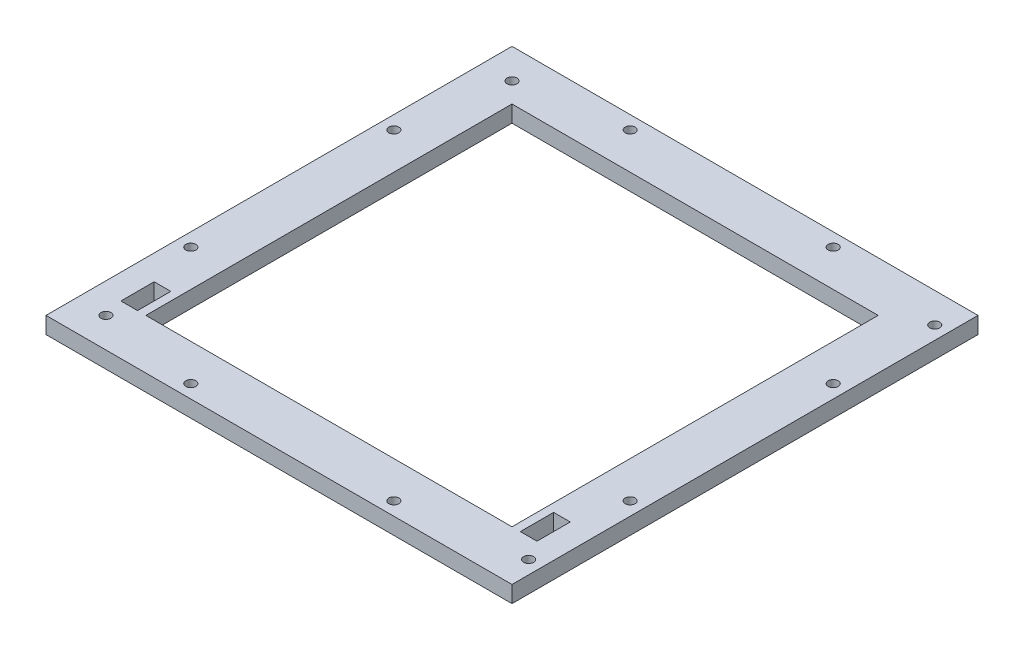
ISO-10303-21;
HEADER;
FILE_DESCRIPTION(('STEP AP214'),'2;1');
FILE_NAME('part.step','',(''),(''),'','','');
FILE_SCHEMA(('AUTOMOTIVE_DESIGN { 1 0 10303 214 1 1 1 1 }'));
ENDSEC;
DATA;
#1=APPLICATION_CONTEXT('core data for automotive mechanical design processes');
#2=APPLICATION_PROTOCOL_DEFINITION('international standard','automotive_design',2000,#1);
#3=PRODUCT_CONTEXT('',#1,'mechanical');
#4=PRODUCT('Part','Part','',(#3));
#5=PRODUCT_RELATED_PRODUCT_CATEGORY('part','',(#4));
#6=PRODUCT_DEFINITION_FORMATION('','',#4);
#7=PRODUCT_DEFINITION_CONTEXT('part definition',#1,'design');
#8=PRODUCT_DEFINITION('design','',#6,#7);
#9=PRODUCT_DEFINITION_SHAPE('','',#8);
#10=(LENGTH_UNIT() NAMED_UNIT(*) SI_UNIT(.MILLI.,.METRE.));
#11=(NAMED_UNIT(*) PLANE_ANGLE_UNIT() SI_UNIT($,.RADIAN.));
#12=(NAMED_UNIT(*) SI_UNIT($,.STERADIAN.) SOLID_ANGLE_UNIT());
#13=UNCERTAINTY_MEASURE_WITH_UNIT(LENGTH_MEASURE(1.E-05),#10,'distance_accuracy_value','');
#14=(GEOMETRIC_REPRESENTATION_CONTEXT(3) GLOBAL_UNCERTAINTY_ASSIGNED_CONTEXT((#13)) GLOBAL_UNIT_ASSIGNED_CONTEXT((#10,
#11,#12)) REPRESENTATION_CONTEXT('',''));
#15=CARTESIAN_POINT('',(0.,0.,0.));
#16=DIRECTION('',(0.,0.,1.));
#17=DIRECTION('',(1.,0.,0.));
#18=AXIS2_PLACEMENT_3D('',#15,#16,#17);
#19=CARTESIAN_POINT('',(0.,5.,0.));
#20=DIRECTION('',(0.,1.,0.));
#21=DIRECTION('',(0.,0.,1.));
#22=AXIS2_PLACEMENT_3D('',#19,#20,#21);
#23=PLANE('',#22);
#24=DIRECTION('',(0.,0.,1.));
#25=VECTOR('',#24,1.);
#26=CARTESIAN_POINT('',(57.5,5.,55.));
#27=LINE('',#26,#25);
#28=CARTESIAN_POINT('',(57.5,5.,45.));
#29=VERTEX_POINT('',#28);
#30=CARTESIAN_POINT('',(57.5,5.,55.));
#31=VERTEX_POINT('',#30);
#32=EDGE_CURVE('E47',#29,#31,#27,.T.);
#33=ORIENTED_EDGE('',*,*,#32,.F.);
#34=DIRECTION('',(-1.,0.,0.));
#35=VECTOR('',#34,1.);
#36=CARTESIAN_POINT('',(57.5,5.,45.));
#37=LINE('',#36,#35);
#38=CARTESIAN_POINT('',(62.5,5.,45.));
#39=VERTEX_POINT('',#38);
#40=EDGE_CURVE('E166',#39,#29,#37,.T.);
#41=ORIENTED_EDGE('',*,*,#40,.F.);
#42=DIRECTION('',(0.,0.,-1.));
#43=VECTOR('',#42,1.);
#44=CARTESIAN_POINT('',(62.5,5.,55.));
#45=LINE('',#44,#43);
#46=CARTESIAN_POINT('',(62.5,5.,55.));
#47=VERTEX_POINT('',#46);
#48=EDGE_CURVE('E169',#47,#39,#45,.T.);
#49=ORIENTED_EDGE('',*,*,#48,.F.);
#50=DIRECTION('',(1.,0.,0.));
#51=VECTOR('',#50,1.);
#52=CARTESIAN_POINT('',(57.5,5.,55.));
#53=LINE('',#52,#51);
#54=EDGE_CURVE('E175',#31,#47,#53,.T.);
#55=ORIENTED_EDGE('',*,*,#54,.F.);
#56=EDGE_LOOP('',(#33,#41,#49,#55));
#57=FACE_BOUND('',#56,.T.);
#58=DIRECTION('',(0.,0.,-1.));
#59=VECTOR('',#58,1.);
#60=CARTESIAN_POINT('',(-57.5,5.,55.));
#61=LINE('',#60,#59);
#62=CARTESIAN_POINT('',(-57.5,5.,55.));
#63=VERTEX_POINT('',#62);
#64=CARTESIAN_POINT('',(-57.5,5.,45.));
#65=VERTEX_POINT('',#64);
#66=EDGE_CURVE('E55',#63,#65,#61,.T.);
#67=ORIENTED_EDGE('',*,*,#66,.F.);
#68=DIRECTION('',(1.,0.,0.));
#69=VECTOR('',#68,1.);
#70=CARTESIAN_POINT('',(-57.5,5.,55.));
#71=LINE('',#70,#69);
#72=CARTESIAN_POINT('',(-62.5,5.,55.));
#73=VERTEX_POINT('',#72);
#74=EDGE_CURVE('E190',#73,#63,#71,.T.);
#75=ORIENTED_EDGE('',*,*,#74,.F.);
#76=DIRECTION('',(0.,0.,1.));
#77=VECTOR('',#76,1.);
#78=CARTESIAN_POINT('',(-62.5,5.,55.));
#79=LINE('',#78,#77);
#80=CARTESIAN_POINT('',(-62.5,5.,45.));
#81=VERTEX_POINT('',#80);
#82=EDGE_CURVE('E204',#81,#73,#79,.T.);
#83=ORIENTED_EDGE('',*,*,#82,.F.);
#84=DIRECTION('',(-1.,0.,0.));
#85=VECTOR('',#84,1.);
#86=CARTESIAN_POINT('',(-57.5,5.,45.));
#87=LINE('',#86,#85);
#88=EDGE_CURVE('E201',#65,#81,#87,.T.);
#89=ORIENTED_EDGE('',*,*,#88,.F.);
#90=EDGE_LOOP('',(#67,#75,#83,#89));
#91=FACE_BOUND('',#90,.T.);
#92=CARTESIAN_POINT('',(-66.,5.,-30.5));
#93=DIRECTION('',(0.,1.,0.));
#94=DIRECTION('',(0.,0.,-1.));
#95=AXIS2_PLACEMENT_3D('',#92,#93,#94);
#96=CIRCLE('',#95,1.5);
#97=CARTESIAN_POINT('',(-66.,5.,-32.));
#98=VERTEX_POINT('',#97);
#99=EDGE_CURVE('E221',#98,#98,#96,.T.);
#100=ORIENTED_EDGE('',*,*,#99,.F.);
#101=EDGE_LOOP('',(#100));
#102=FACE_BOUND('',#101,.T.);
#103=CARTESIAN_POINT('',(-30.5,5.,-66.));
#104=DIRECTION('',(0.,1.,0.));
#105=DIRECTION('',(0.,0.,-1.));
#106=AXIS2_PLACEMENT_3D('',#103,#104,#105);
#107=CIRCLE('',#106,1.5);
#108=CARTESIAN_POINT('',(-30.5,5.,-67.5));
#109=VERTEX_POINT('',#108);
#110=EDGE_CURVE('E233',#109,#109,#107,.T.);
#111=ORIENTED_EDGE('',*,*,#110,.F.);
#112=EDGE_LOOP('',(#111));
#113=FACE_BOUND('',#112,.T.);
#114=CARTESIAN_POINT('',(-30.5,5.,66.));
#115=DIRECTION('',(0.,1.,0.));
#116=DIRECTION('',(0.,0.,1.));
#117=AXIS2_PLACEMENT_3D('',#114,#115,#116);
#118=CIRCLE('',#117,1.5);
#119=CARTESIAN_POINT('',(-30.5,5.,67.5));
#120=VERTEX_POINT('',#119);
#121=EDGE_CURVE('E276',#120,#120,#118,.T.);
#122=ORIENTED_EDGE('',*,*,#121,.F.);
#123=EDGE_LOOP('',(#122));
#124=FACE_BOUND('',#123,.T.);
#125=CARTESIAN_POINT('',(66.,5.,-30.5));
#126=DIRECTION('',(0.,1.,0.));
#127=DIRECTION('',(0.,0.,1.));
#128=AXIS2_PLACEMENT_3D('',#125,#126,#127);
#129=CIRCLE('',#128,1.5);
#130=CARTESIAN_POINT('',(66.,5.,-29.));
#131=VERTEX_POINT('',#130);
#132=EDGE_CURVE('E288',#131,#131,#129,.T.);
#133=ORIENTED_EDGE('',*,*,#132,.F.);
#134=EDGE_LOOP('',(#133));
#135=FACE_BOUND('',#134,.T.);
#136=CARTESIAN_POINT('',(66.,5.,61.));
#137=DIRECTION('',(0.,1.,0.));
#138=DIRECTION('',(0.,0.,1.));
#139=AXIS2_PLACEMENT_3D('',#136,#137,#138);
#140=CIRCLE('',#139,1.5);
#141=CARTESIAN_POINT('',(66.,5.,62.5));
#142=VERTEX_POINT('',#141);
#143=EDGE_CURVE('E300',#142,#142,#140,.T.);
#144=ORIENTED_EDGE('',*,*,#143,.F.);
#145=EDGE_LOOP('',(#144));
#146=FACE_BOUND('',#145,.T.);
#147=CARTESIAN_POINT('',(-61.,5.,-61.));
#148=DIRECTION('',(0.,1.,0.));
#149=DIRECTION('',(0.,0.,1.));
#150=AXIS2_PLACEMENT_3D('',#147,#148,#149);
#151=CIRCLE('',#150,1.5);
#152=CARTESIAN_POINT('',(-61.,5.,-59.5));
#153=VERTEX_POINT('',#152);
#154=EDGE_CURVE('E312',#153,#153,#151,.T.);
#155=ORIENTED_EDGE('',*,*,#154,.F.);
#156=EDGE_LOOP('',(#155));
#157=FACE_BOUND('',#156,.T.);
#158=DIRECTION('',(0.,0.,1.));
#159=VECTOR('',#158,1.);
#160=CARTESIAN_POINT('',(-70.,5.,70.));
#161=LINE('',#160,#159);
#162=CARTESIAN_POINT('',(-70.,5.,-70.));
#163=VERTEX_POINT('',#162);
#164=CARTESIAN_POINT('',(-70.,5.,70.));
#165=VERTEX_POINT('',#164);
#166=EDGE_CURVE('E318',#163,#165,#161,.T.);
#167=ORIENTED_EDGE('',*,*,#166,.T.);
#168=DIRECTION('',(1.,0.,0.));
#169=VECTOR('',#168,1.);
#170=CARTESIAN_POINT('',(70.,5.,70.));
#171=LINE('',#170,#169);
#172=CARTESIAN_POINT('',(70.,5.,70.));
#173=VERTEX_POINT('',#172);
#174=EDGE_CURVE('E321',#165,#173,#171,.T.);
#175=ORIENTED_EDGE('',*,*,#174,.T.);
#176=DIRECTION('',(0.,0.,-1.));
#177=VECTOR('',#176,1.);
#178=CARTESIAN_POINT('',(70.,5.,70.));
#179=LINE('',#178,#177);
#180=CARTESIAN_POINT('',(70.,5.,-70.));
#181=VERTEX_POINT('',#180);
#182=EDGE_CURVE('E324',#173,#181,#179,.T.);
#183=ORIENTED_EDGE('',*,*,#182,.T.);
#184=DIRECTION('',(-1.,0.,0.));
#185=VECTOR('',#184,1.);
#186=CARTESIAN_POINT('',(70.,5.,-70.));
#187=LINE('',#186,#185);
#188=EDGE_CURVE('E326',#181,#163,#187,.T.);
#189=ORIENTED_EDGE('',*,*,#188,.T.);
#190=EDGE_LOOP('',(#167,#175,#183,#189));
#191=FACE_BOUND('',#190,.T.);
#192=CARTESIAN_POINT('',(66.,5.,-61.));
#193=DIRECTION('',(0.,1.,0.));
#194=DIRECTION('',(0.,0.,1.));
#195=AXIS2_PLACEMENT_3D('',#192,#193,#194);
#196=CIRCLE('',#195,1.5);
#197=CARTESIAN_POINT('',(66.,5.,-59.5));
#198=VERTEX_POINT('',#197);
#199=EDGE_CURVE('E306',#198,#198,#196,.T.);
#200=ORIENTED_EDGE('',*,*,#199,.F.);
#201=EDGE_LOOP('',(#200));
#202=FACE_BOUND('',#201,.T.);
#203=CARTESIAN_POINT('',(-61.,5.,61.));
#204=DIRECTION('',(0.,1.,0.));
#205=DIRECTION('',(0.,0.,1.));
#206=AXIS2_PLACEMENT_3D('',#203,#204,#205);
#207=CIRCLE('',#206,1.5);
#208=CARTESIAN_POINT('',(-61.,5.,62.5));
#209=VERTEX_POINT('',#208);
#210=EDGE_CURVE('E294',#209,#209,#207,.T.);
#211=ORIENTED_EDGE('',*,*,#210,.F.);
#212=EDGE_LOOP('',(#211));
#213=FACE_BOUND('',#212,.T.);
#214=CARTESIAN_POINT('',(66.,5.,30.5));
#215=DIRECTION('',(0.,1.,0.));
#216=DIRECTION('',(0.,0.,1.));
#217=AXIS2_PLACEMENT_3D('',#214,#215,#216);
#218=CIRCLE('',#217,1.5);
#219=CARTESIAN_POINT('',(66.,5.,32.));
#220=VERTEX_POINT('',#219);
#221=EDGE_CURVE('E282',#220,#220,#218,.T.);
#222=ORIENTED_EDGE('',*,*,#221,.F.);
#223=EDGE_LOOP('',(#222));
#224=FACE_BOUND('',#223,.T.);
#225=CARTESIAN_POINT('',(30.5,5.,66.));
#226=DIRECTION('',(0.,1.,0.));
#227=DIRECTION('',(0.,0.,1.));
#228=AXIS2_PLACEMENT_3D('',#225,#226,#227);
#229=CIRCLE('',#228,1.5);
#230=CARTESIAN_POINT('',(30.5,5.,67.5));
#231=VERTEX_POINT('',#230);
#232=EDGE_CURVE('E270',#231,#231,#229,.T.);
#233=ORIENTED_EDGE('',*,*,#232,.F.);
#234=EDGE_LOOP('',(#233));
#235=FACE_BOUND('',#234,.T.);
#236=DIRECTION('',(-1.,0.,0.));
#237=VECTOR('',#236,1.);
#238=CARTESIAN_POINT('',(-55.,5.,-55.));
#239=LINE('',#238,#237);
#240=CARTESIAN_POINT('',(55.,5.,-55.));
#241=VERTEX_POINT('',#240);
#242=CARTESIAN_POINT('',(-55.,5.,-55.));
#243=VERTEX_POINT('',#242);
#244=EDGE_CURVE('E241',#241,#243,#239,.T.);
#245=ORIENTED_EDGE('',*,*,#244,.F.);
#246=DIRECTION('',(0.,0.,-1.));
#247=VECTOR('',#246,1.);
#248=CARTESIAN_POINT('',(55.,5.,-55.));
#249=LINE('',#248,#247);
#250=CARTESIAN_POINT('',(55.,5.,55.));
#251=VERTEX_POINT('',#250);
#252=EDGE_CURVE('E239',#251,#241,#249,.T.);
#253=ORIENTED_EDGE('',*,*,#252,.F.);
#254=DIRECTION('',(1.,0.,0.));
#255=VECTOR('',#254,1.);
#256=CARTESIAN_POINT('',(-55.,5.,55.));
#257=LINE('',#256,#255);
#258=CARTESIAN_POINT('',(-55.,5.,55.));
#259=VERTEX_POINT('',#258);
#260=EDGE_CURVE('E247',#259,#251,#257,.T.);
#261=ORIENTED_EDGE('',*,*,#260,.F.);
#262=DIRECTION('',(0.,0.,1.));
#263=VECTOR('',#262,1.);
#264=CARTESIAN_POINT('',(-55.,5.,-55.));
#265=LINE('',#264,#263);
#266=EDGE_CURVE('E244',#243,#259,#265,.T.);
#267=ORIENTED_EDGE('',*,*,#266,.F.);
#268=EDGE_LOOP('',(#245,#253,#261,#267));
#269=FACE_BOUND('',#268,.T.);
#270=CARTESIAN_POINT('',(30.5,5.,-66.));
#271=DIRECTION('',(0.,1.,0.));
#272=DIRECTION('',(0.,0.,-1.));
#273=AXIS2_PLACEMENT_3D('',#270,#271,#272);
#274=CIRCLE('',#273,1.5);
#275=CARTESIAN_POINT('',(30.5,5.,-67.5));
#276=VERTEX_POINT('',#275);
#277=EDGE_CURVE('E227',#276,#276,#274,.T.);
#278=ORIENTED_EDGE('',*,*,#277,.F.);
#279=EDGE_LOOP('',(#278));
#280=FACE_BOUND('',#279,.T.);
#281=CARTESIAN_POINT('',(-66.,5.,30.5));
#282=DIRECTION('',(0.,1.,0.));
#283=DIRECTION('',(0.,0.,-1.));
#284=AXIS2_PLACEMENT_3D('',#281,#282,#283);
#285=CIRCLE('',#284,1.5);
#286=CARTESIAN_POINT('',(-66.,5.,29.));
#287=VERTEX_POINT('',#286);
#288=EDGE_CURVE('E215',#287,#287,#285,.T.);
#289=ORIENTED_EDGE('',*,*,#288,.F.);
#290=EDGE_LOOP('',(#289));
#291=FACE_BOUND('',#290,.T.);
#292=ADVANCED_FACE('F32',(#57,#91,#102,#113,#124,#135,#146,#157,#191,#202,#213,#224,#235,#269,
#280,#291),#23,.T.);
#293=CARTESIAN_POINT('',(0.,0.,0.));
#294=DIRECTION('',(0.,1.,0.));
#295=DIRECTION('',(0.,0.,1.));
#296=AXIS2_PLACEMENT_3D('',#293,#294,#295);
#297=PLANE('',#296);
#298=DIRECTION('',(-1.,0.,0.));
#299=VECTOR('',#298,1.);
#300=CARTESIAN_POINT('',(57.5,0.,45.));
#301=LINE('',#300,#299);
#302=CARTESIAN_POINT('',(62.5,0.,45.));
#303=VERTEX_POINT('',#302);
#304=CARTESIAN_POINT('',(57.5,0.,45.));
#305=VERTEX_POINT('',#304);
#306=EDGE_CURVE('E153',#303,#305,#301,.T.);
#307=ORIENTED_EDGE('',*,*,#306,.T.);
#308=DIRECTION('',(0.,0.,1.));
#309=VECTOR('',#308,1.);
#310=CARTESIAN_POINT('',(57.5,0.,55.));
#311=LINE('',#310,#309);
#312=CARTESIAN_POINT('',(57.5,0.,55.));
#313=VERTEX_POINT('',#312);
#314=EDGE_CURVE('E147',#305,#313,#311,.T.);
#315=ORIENTED_EDGE('',*,*,#314,.T.);
#316=DIRECTION('',(1.,0.,0.));
#317=VECTOR('',#316,1.);
#318=CARTESIAN_POINT('',(57.5,0.,55.));
#319=LINE('',#318,#317);
#320=CARTESIAN_POINT('',(62.5,0.,55.));
#321=VERTEX_POINT('',#320);
#322=EDGE_CURVE('E157',#313,#321,#319,.T.);
#323=ORIENTED_EDGE('',*,*,#322,.T.);
#324=DIRECTION('',(0.,0.,-1.));
#325=VECTOR('',#324,1.);
#326=CARTESIAN_POINT('',(62.5,0.,55.));
#327=LINE('',#326,#325);
#328=EDGE_CURVE('E161',#321,#303,#327,.T.);
#329=ORIENTED_EDGE('',*,*,#328,.T.);
#330=EDGE_LOOP('',(#307,#315,#323,#329));
#331=FACE_BOUND('',#330,.T.);
#332=DIRECTION('',(1.,0.,0.));
#333=VECTOR('',#332,1.);
#334=CARTESIAN_POINT('',(-57.5,0.,55.));
#335=LINE('',#334,#333);
#336=CARTESIAN_POINT('',(-62.5,0.,55.));
#337=VERTEX_POINT('',#336);
#338=CARTESIAN_POINT('',(-57.5,0.,55.));
#339=VERTEX_POINT('',#338);
#340=EDGE_CURVE('E196',#337,#339,#335,.T.);
#341=ORIENTED_EDGE('',*,*,#340,.T.);
#342=DIRECTION('',(0.,0.,-1.));
#343=VECTOR('',#342,1.);
#344=CARTESIAN_POINT('',(-57.5,0.,55.));
#345=LINE('',#344,#343);
#346=CARTESIAN_POINT('',(-57.5,0.,45.));
#347=VERTEX_POINT('',#346);
#348=EDGE_CURVE('E186',#339,#347,#345,.T.);
#349=ORIENTED_EDGE('',*,*,#348,.T.);
#350=DIRECTION('',(-1.,0.,0.));
#351=VECTOR('',#350,1.);
#352=CARTESIAN_POINT('',(-57.5,0.,45.));
#353=LINE('',#352,#351);
#354=CARTESIAN_POINT('',(-62.5,0.,45.));
#355=VERTEX_POINT('',#354);
#356=EDGE_CURVE('E189',#347,#355,#353,.T.);
#357=ORIENTED_EDGE('',*,*,#356,.T.);
#358=DIRECTION('',(0.,0.,1.));
#359=VECTOR('',#358,1.);
#360=CARTESIAN_POINT('',(-62.5,0.,55.));
#361=LINE('',#360,#359);
#362=EDGE_CURVE('E193',#355,#337,#361,.T.);
#363=ORIENTED_EDGE('',*,*,#362,.T.);
#364=EDGE_LOOP('',(#341,#349,#357,#363));
#365=FACE_BOUND('',#364,.T.);
#366=CARTESIAN_POINT('',(30.5,0.,66.));
#367=DIRECTION('',(0.,1.,0.));
#368=DIRECTION('',(0.,0.,1.));
#369=AXIS2_PLACEMENT_3D('',#366,#367,#368);
#370=CIRCLE('',#369,1.5);
#371=CARTESIAN_POINT('',(30.5,0.,67.5));
#372=VERTEX_POINT('',#371);
#373=EDGE_CURVE('E269',#372,#372,#370,.T.);
#374=ORIENTED_EDGE('',*,*,#373,.T.);
#375=EDGE_LOOP('',(#374));
#376=FACE_BOUND('',#375,.T.);
#377=CARTESIAN_POINT('',(-30.5,0.,66.));
#378=DIRECTION('',(0.,1.,0.));
#379=DIRECTION('',(0.,0.,1.));
#380=AXIS2_PLACEMENT_3D('',#377,#378,#379);
#381=CIRCLE('',#380,1.5);
#382=CARTESIAN_POINT('',(-30.5,0.,67.5));
#383=VERTEX_POINT('',#382);
#384=EDGE_CURVE('E273',#383,#383,#381,.T.);
#385=ORIENTED_EDGE('',*,*,#384,.T.);
#386=EDGE_LOOP('',(#385));
#387=FACE_BOUND('',#386,.T.);
#388=CARTESIAN_POINT('',(66.,0.,30.5));
#389=DIRECTION('',(0.,1.,0.));
#390=DIRECTION('',(0.,0.,1.));
#391=AXIS2_PLACEMENT_3D('',#388,#389,#390);
#392=CIRCLE('',#391,1.5);
#393=CARTESIAN_POINT('',(66.,0.,32.));
#394=VERTEX_POINT('',#393);
#395=EDGE_CURVE('E279',#394,#394,#392,.T.);
#396=ORIENTED_EDGE('',*,*,#395,.T.);
#397=EDGE_LOOP('',(#396));
#398=FACE_BOUND('',#397,.T.);
#399=CARTESIAN_POINT('',(66.,0.,-30.5));
#400=DIRECTION('',(0.,1.,0.));
#401=DIRECTION('',(0.,0.,1.));
#402=AXIS2_PLACEMENT_3D('',#399,#400,#401);
#403=CIRCLE('',#402,1.5);
#404=CARTESIAN_POINT('',(66.,0.,-29.));
#405=VERTEX_POINT('',#404);
#406=EDGE_CURVE('E285',#405,#405,#403,.T.);
#407=ORIENTED_EDGE('',*,*,#406,.T.);
#408=EDGE_LOOP('',(#407));
#409=FACE_BOUND('',#408,.T.);
#410=CARTESIAN_POINT('',(-61.,0.,61.));
#411=DIRECTION('',(0.,1.,0.));
#412=DIRECTION('',(0.,0.,1.));
#413=AXIS2_PLACEMENT_3D('',#410,#411,#412);
#414=CIRCLE('',#413,1.5);
#415=CARTESIAN_POINT('',(-61.,0.,62.5));
#416=VERTEX_POINT('',#415);
#417=EDGE_CURVE('E291',#416,#416,#414,.T.);
#418=ORIENTED_EDGE('',*,*,#417,.T.);
#419=EDGE_LOOP('',(#418));
#420=FACE_BOUND('',#419,.T.);
#421=CARTESIAN_POINT('',(66.,0.,61.));
#422=DIRECTION('',(0.,1.,0.));
#423=DIRECTION('',(0.,0.,1.));
#424=AXIS2_PLACEMENT_3D('',#421,#422,#423);
#425=CIRCLE('',#424,1.5);
#426=CARTESIAN_POINT('',(66.,0.,62.5));
#427=VERTEX_POINT('',#426);
#428=EDGE_CURVE('E297',#427,#427,#425,.T.);
#429=ORIENTED_EDGE('',*,*,#428,.T.);
#430=EDGE_LOOP('',(#429));
#431=FACE_BOUND('',#430,.T.);
#432=CARTESIAN_POINT('',(66.,0.,-61.));
#433=DIRECTION('',(0.,1.,0.));
#434=DIRECTION('',(0.,0.,1.));
#435=AXIS2_PLACEMENT_3D('',#432,#433,#434);
#436=CIRCLE('',#435,1.5);
#437=CARTESIAN_POINT('',(66.,0.,-59.5));
#438=VERTEX_POINT('',#437);
#439=EDGE_CURVE('E303',#438,#438,#436,.T.);
#440=ORIENTED_EDGE('',*,*,#439,.T.);
#441=EDGE_LOOP('',(#440));
#442=FACE_BOUND('',#441,.T.);
#443=CARTESIAN_POINT('',(-61.,0.,-61.));
#444=DIRECTION('',(0.,1.,0.));
#445=DIRECTION('',(0.,0.,1.));
#446=AXIS2_PLACEMENT_3D('',#443,#444,#445);
#447=CIRCLE('',#446,1.5);
#448=CARTESIAN_POINT('',(-61.,0.,-59.5));
#449=VERTEX_POINT('',#448);
#450=EDGE_CURVE('E309',#449,#449,#447,.T.);
#451=ORIENTED_EDGE('',*,*,#450,.T.);
#452=EDGE_LOOP('',(#451));
#453=FACE_BOUND('',#452,.T.);
#454=DIRECTION('',(0.,0.,1.));
#455=VECTOR('',#454,1.);
#456=CARTESIAN_POINT('',(-70.,0.,70.));
#457=LINE('',#456,#455);
#458=CARTESIAN_POINT('',(-70.,0.,-70.));
#459=VERTEX_POINT('',#458);
#460=CARTESIAN_POINT('',(-70.,0.,70.));
#461=VERTEX_POINT('',#460);
#462=EDGE_CURVE('E315',#459,#461,#457,.T.);
#463=ORIENTED_EDGE('',*,*,#462,.F.);
#464=DIRECTION('',(-1.,0.,0.));
#465=VECTOR('',#464,1.);
#466=CARTESIAN_POINT('',(70.,0.,-70.));
#467=LINE('',#466,#465);
#468=CARTESIAN_POINT('',(70.,0.,-70.));
#469=VERTEX_POINT('',#468);
#470=EDGE_CURVE('E322',#469,#459,#467,.T.);
#471=ORIENTED_EDGE('',*,*,#470,.F.);
#472=DIRECTION('',(0.,0.,-1.));
#473=VECTOR('',#472,1.);
#474=CARTESIAN_POINT('',(70.,0.,70.));
#475=LINE('',#474,#473);
#476=CARTESIAN_POINT('',(70.,0.,70.));
#477=VERTEX_POINT('',#476);
#478=EDGE_CURVE('E333',#477,#469,#475,.T.);
#479=ORIENTED_EDGE('',*,*,#478,.F.);
#480=DIRECTION('',(1.,0.,0.));
#481=VECTOR('',#480,1.);
#482=CARTESIAN_POINT('',(70.,0.,70.));
#483=LINE('',#482,#481);
#484=EDGE_CURVE('E331',#461,#477,#483,.T.);
#485=ORIENTED_EDGE('',*,*,#484,.F.);
#486=EDGE_LOOP('',(#463,#471,#479,#485));
#487=FACE_BOUND('',#486,.T.);
#488=DIRECTION('',(0.,0.,-1.));
#489=VECTOR('',#488,1.);
#490=CARTESIAN_POINT('',(55.,0.,-55.));
#491=LINE('',#490,#489);
#492=CARTESIAN_POINT('',(55.,0.,55.));
#493=VERTEX_POINT('',#492);
#494=CARTESIAN_POINT('',(55.,0.,-55.));
#495=VERTEX_POINT('',#494);
#496=EDGE_CURVE('E236',#493,#495,#491,.T.);
#497=ORIENTED_EDGE('',*,*,#496,.T.);
#498=DIRECTION('',(-1.,0.,0.));
#499=VECTOR('',#498,1.);
#500=CARTESIAN_POINT('',(-55.,0.,-55.));
#501=LINE('',#500,#499);
#502=CARTESIAN_POINT('',(-55.,0.,-55.));
#503=VERTEX_POINT('',#502);
#504=EDGE_CURVE('E252',#495,#503,#501,.T.);
#505=ORIENTED_EDGE('',*,*,#504,.T.);
#506=DIRECTION('',(0.,0.,1.));
#507=VECTOR('',#506,1.);
#508=CARTESIAN_POINT('',(-55.,0.,-55.));
#509=LINE('',#508,#507);
#510=CARTESIAN_POINT('',(-55.,0.,55.));
#511=VERTEX_POINT('',#510);
#512=EDGE_CURVE('E255',#503,#511,#509,.T.);
#513=ORIENTED_EDGE('',*,*,#512,.T.);
#514=DIRECTION('',(1.,0.,0.));
#515=VECTOR('',#514,1.);
#516=CARTESIAN_POINT('',(-55.,0.,55.));
#517=LINE('',#516,#515);
#518=EDGE_CURVE('E242',#511,#493,#517,.T.);
#519=ORIENTED_EDGE('',*,*,#518,.T.);
#520=EDGE_LOOP('',(#497,#505,#513,#519));
#521=FACE_BOUND('',#520,.T.);
#522=CARTESIAN_POINT('',(-30.5,0.,-66.));
#523=DIRECTION('',(0.,1.,0.));
#524=DIRECTION('',(0.,0.,-1.));
#525=AXIS2_PLACEMENT_3D('',#522,#523,#524);
#526=CIRCLE('',#525,1.5);
#527=CARTESIAN_POINT('',(-30.5,0.,-67.5));
#528=VERTEX_POINT('',#527);
#529=EDGE_CURVE('E230',#528,#528,#526,.T.);
#530=ORIENTED_EDGE('',*,*,#529,.T.);
#531=EDGE_LOOP('',(#530));
#532=FACE_BOUND('',#531,.T.);
#533=CARTESIAN_POINT('',(30.5,0.,-66.));
#534=DIRECTION('',(0.,1.,0.));
#535=DIRECTION('',(0.,0.,-1.));
#536=AXIS2_PLACEMENT_3D('',#533,#534,#535);
#537=CIRCLE('',#536,1.5);
#538=CARTESIAN_POINT('',(30.5,0.,-67.5));
#539=VERTEX_POINT('',#538);
#540=EDGE_CURVE('E224',#539,#539,#537,.T.);
#541=ORIENTED_EDGE('',*,*,#540,.T.);
#542=EDGE_LOOP('',(#541));
#543=FACE_BOUND('',#542,.T.);
#544=CARTESIAN_POINT('',(-66.,0.,-30.5));
#545=DIRECTION('',(0.,1.,0.));
#546=DIRECTION('',(0.,0.,-1.));
#547=AXIS2_PLACEMENT_3D('',#544,#545,#546);
#548=CIRCLE('',#547,1.5);
#549=CARTESIAN_POINT('',(-66.,0.,-32.));
#550=VERTEX_POINT('',#549);
#551=EDGE_CURVE('E218',#550,#550,#548,.T.);
#552=ORIENTED_EDGE('',*,*,#551,.T.);
#553=EDGE_LOOP('',(#552));
#554=FACE_BOUND('',#553,.T.);
#555=CARTESIAN_POINT('',(-66.,0.,30.5));
#556=DIRECTION('',(0.,1.,0.));
#557=DIRECTION('',(0.,0.,-1.));
#558=AXIS2_PLACEMENT_3D('',#555,#556,#557);
#559=CIRCLE('',#558,1.5);
#560=CARTESIAN_POINT('',(-66.,0.,29.));
#561=VERTEX_POINT('',#560);
#562=EDGE_CURVE('E182',#561,#561,#559,.T.);
#563=ORIENTED_EDGE('',*,*,#562,.T.);
#564=EDGE_LOOP('',(#563));
#565=FACE_BOUND('',#564,.T.);
#566=ADVANCED_FACE('F163',(#331,#365,#376,#387,#398,#409,#420,#431,#442,#453,#487,#521,#532,
#543,#554,#565),#297,.F.);
#567=CARTESIAN_POINT('',(-70.,5.,70.));
#568=DIRECTION('',(1.,0.,0.));
#569=DIRECTION('',(0.,0.,-1.));
#570=AXIS2_PLACEMENT_3D('',#567,#568,#569);
#571=PLANE('',#570);
#572=ORIENTED_EDGE('',*,*,#462,.T.);
#573=DIRECTION('',(0.,-1.,0.));
#574=VECTOR('',#573,1.);
#575=CARTESIAN_POINT('',(-70.,5.,70.));
#576=LINE('',#575,#574);
#577=EDGE_CURVE('E11',#165,#461,#576,.T.);
#578=ORIENTED_EDGE('',*,*,#577,.F.);
#579=ORIENTED_EDGE('',*,*,#166,.F.);
#580=DIRECTION('',(0.,-1.,0.));
#581=VECTOR('',#580,1.);
#582=CARTESIAN_POINT('',(-70.,5.,-70.));
#583=LINE('',#582,#581);
#584=EDGE_CURVE('E328',#163,#459,#583,.T.);
#585=ORIENTED_EDGE('',*,*,#584,.T.);
#586=EDGE_LOOP('',(#572,#578,#579,#585));
#587=FACE_BOUND('',#586,.T.);
#588=ADVANCED_FACE('F34',(#587),#571,.F.);
#589=CARTESIAN_POINT('',(70.,5.,70.));
#590=DIRECTION('',(0.,0.,-1.));
#591=DIRECTION('',(-1.,0.,0.));
#592=AXIS2_PLACEMENT_3D('',#589,#590,#591);
#593=PLANE('',#592);
#594=ORIENTED_EDGE('',*,*,#484,.T.);
#595=DIRECTION('',(0.,-1.,0.));
#596=VECTOR('',#595,1.);
#597=CARTESIAN_POINT('',(70.,5.,70.));
#598=LINE('',#597,#596);
#599=EDGE_CURVE('E40',#173,#477,#598,.T.);
#600=ORIENTED_EDGE('',*,*,#599,.F.);
#601=ORIENTED_EDGE('',*,*,#174,.F.);
#602=ORIENTED_EDGE('',*,*,#577,.T.);
#603=EDGE_LOOP('',(#594,#600,#601,#602));
#604=FACE_BOUND('',#603,.T.);
#605=ADVANCED_FACE('F361',(#604),#593,.F.);
#606=CARTESIAN_POINT('',(70.,5.,70.));
#607=DIRECTION('',(-1.,0.,0.));
#608=DIRECTION('',(0.,0.,1.));
#609=AXIS2_PLACEMENT_3D('',#606,#607,#608);
#610=PLANE('',#609);
#611=ORIENTED_EDGE('',*,*,#478,.T.);
#612=DIRECTION('',(0.,-1.,0.));
#613=VECTOR('',#612,1.);
#614=CARTESIAN_POINT('',(70.,5.,-70.));
#615=LINE('',#614,#613);
#616=EDGE_CURVE('E338',#181,#469,#615,.T.);
#617=ORIENTED_EDGE('',*,*,#616,.F.);
#618=ORIENTED_EDGE('',*,*,#182,.F.);
#619=ORIENTED_EDGE('',*,*,#599,.T.);
#620=EDGE_LOOP('',(#611,#617,#618,#619));
#621=FACE_BOUND('',#620,.T.);
#622=ADVANCED_FACE('F345',(#621),#610,.F.);
#623=CARTESIAN_POINT('',(70.,5.,-70.));
#624=DIRECTION('',(0.,0.,1.));
#625=DIRECTION('',(1.,0.,0.));
#626=AXIS2_PLACEMENT_3D('',#623,#624,#625);
#627=PLANE('',#626);
#628=ORIENTED_EDGE('',*,*,#470,.T.);
#629=ORIENTED_EDGE('',*,*,#584,.F.);
#630=ORIENTED_EDGE('',*,*,#188,.F.);
#631=ORIENTED_EDGE('',*,*,#616,.T.);
#632=EDGE_LOOP('',(#628,#629,#630,#631));
#633=FACE_BOUND('',#632,.T.);
#634=ADVANCED_FACE('F354',(#633),#627,.F.);
#635=CARTESIAN_POINT('',(-61.,5.,-61.));
#636=DIRECTION('',(0.,-1.,0.));
#637=DIRECTION('',(0.,0.,-1.));
#638=AXIS2_PLACEMENT_3D('',#635,#636,#637);
#639=CYLINDRICAL_SURFACE('',#638,1.5);
#640=ORIENTED_EDGE('',*,*,#154,.T.);
#641=EDGE_LOOP('',(#640));
#642=FACE_BOUND('',#641,.T.);
#643=ORIENTED_EDGE('',*,*,#450,.F.);
#644=EDGE_LOOP('',(#643));
#645=FACE_BOUND('',#644,.T.);
#646=ADVANCED_FACE('F378',(#642,#645),#639,.F.);
#647=CARTESIAN_POINT('',(66.,5.,-61.));
#648=DIRECTION('',(0.,-1.,0.));
#649=DIRECTION('',(0.,0.,-1.));
#650=AXIS2_PLACEMENT_3D('',#647,#648,#649);
#651=CYLINDRICAL_SURFACE('',#650,1.5);
#652=ORIENTED_EDGE('',*,*,#199,.T.);
#653=EDGE_LOOP('',(#652));
#654=FACE_BOUND('',#653,.T.);
#655=ORIENTED_EDGE('',*,*,#439,.F.);
#656=EDGE_LOOP('',(#655));
#657=FACE_BOUND('',#656,.T.);
#658=ADVANCED_FACE('F385',(#654,#657),#651,.F.);
#659=CARTESIAN_POINT('',(66.,5.,61.));
#660=DIRECTION('',(0.,-1.,0.));
#661=DIRECTION('',(0.,0.,-1.));
#662=AXIS2_PLACEMENT_3D('',#659,#660,#661);
#663=CYLINDRICAL_SURFACE('',#662,1.5);
#664=ORIENTED_EDGE('',*,*,#143,.T.);
#665=EDGE_LOOP('',(#664));
#666=FACE_BOUND('',#665,.T.);
#667=ORIENTED_EDGE('',*,*,#428,.F.);
#668=EDGE_LOOP('',(#667));
#669=FACE_BOUND('',#668,.T.);
#670=ADVANCED_FACE('F390',(#666,#669),#663,.F.);
#671=CARTESIAN_POINT('',(-61.,5.,61.));
#672=DIRECTION('',(0.,-1.,0.));
#673=DIRECTION('',(0.,0.,-1.));
#674=AXIS2_PLACEMENT_3D('',#671,#672,#673);
#675=CYLINDRICAL_SURFACE('',#674,1.5);
#676=ORIENTED_EDGE('',*,*,#210,.T.);
#677=EDGE_LOOP('',(#676));
#678=FACE_BOUND('',#677,.T.);
#679=ORIENTED_EDGE('',*,*,#417,.F.);
#680=EDGE_LOOP('',(#679));
#681=FACE_BOUND('',#680,.T.);
#682=ADVANCED_FACE('F400',(#678,#681),#675,.F.);
#683=CARTESIAN_POINT('',(66.,5.,-30.5));
#684=DIRECTION('',(0.,-1.,0.));
#685=DIRECTION('',(0.,0.,-1.));
#686=AXIS2_PLACEMENT_3D('',#683,#684,#685);
#687=CYLINDRICAL_SURFACE('',#686,1.5);
#688=ORIENTED_EDGE('',*,*,#132,.T.);
#689=EDGE_LOOP('',(#688));
#690=FACE_BOUND('',#689,.T.);
#691=ORIENTED_EDGE('',*,*,#406,.F.);
#692=EDGE_LOOP('',(#691));
#693=FACE_BOUND('',#692,.T.);
#694=ADVANCED_FACE('F407',(#690,#693),#687,.F.);
#695=CARTESIAN_POINT('',(66.,5.,30.5));
#696=DIRECTION('',(0.,-1.,0.));
#697=DIRECTION('',(0.,0.,-1.));
#698=AXIS2_PLACEMENT_3D('',#695,#696,#697);
#699=CYLINDRICAL_SURFACE('',#698,1.5);
#700=ORIENTED_EDGE('',*,*,#221,.T.);
#701=EDGE_LOOP('',(#700));
#702=FACE_BOUND('',#701,.T.);
#703=ORIENTED_EDGE('',*,*,#395,.F.);
#704=EDGE_LOOP('',(#703));
#705=FACE_BOUND('',#704,.T.);
#706=ADVANCED_FACE('F411',(#702,#705),#699,.F.);
#707=CARTESIAN_POINT('',(-30.5,5.,66.));
#708=DIRECTION('',(0.,-1.,0.));
#709=DIRECTION('',(0.,0.,-1.));
#710=AXIS2_PLACEMENT_3D('',#707,#708,#709);
#711=CYLINDRICAL_SURFACE('',#710,1.5);
#712=ORIENTED_EDGE('',*,*,#121,.T.);
#713=EDGE_LOOP('',(#712));
#714=FACE_BOUND('',#713,.T.);
#715=ORIENTED_EDGE('',*,*,#384,.F.);
#716=EDGE_LOOP('',(#715));
#717=FACE_BOUND('',#716,.T.);
#718=ADVANCED_FACE('F415',(#714,#717),#711,.F.);
#719=CARTESIAN_POINT('',(30.5,5.,66.));
#720=DIRECTION('',(0.,-1.,0.));
#721=DIRECTION('',(0.,0.,-1.));
#722=AXIS2_PLACEMENT_3D('',#719,#720,#721);
#723=CYLINDRICAL_SURFACE('',#722,1.5);
#724=ORIENTED_EDGE('',*,*,#232,.T.);
#725=EDGE_LOOP('',(#724));
#726=FACE_BOUND('',#725,.T.);
#727=ORIENTED_EDGE('',*,*,#373,.F.);
#728=EDGE_LOOP('',(#727));
#729=FACE_BOUND('',#728,.T.);
#730=ADVANCED_FACE('F419',(#726,#729),#723,.F.);
#731=CARTESIAN_POINT('',(55.,5.,-55.));
#732=DIRECTION('',(-1.,0.,0.));
#733=DIRECTION('',(0.,0.,1.));
#734=AXIS2_PLACEMENT_3D('',#731,#732,#733);
#735=PLANE('',#734);
#736=ORIENTED_EDGE('',*,*,#496,.F.);
#737=DIRECTION('',(0.,-1.,0.));
#738=VECTOR('',#737,1.);
#739=CARTESIAN_POINT('',(55.,5.,55.));
#740=LINE('',#739,#738);
#741=EDGE_CURVE('E249',#251,#493,#740,.T.);
#742=ORIENTED_EDGE('',*,*,#741,.F.);
#743=ORIENTED_EDGE('',*,*,#252,.T.);
#744=DIRECTION('',(0.,-1.,0.));
#745=VECTOR('',#744,1.);
#746=CARTESIAN_POINT('',(55.,5.,-55.));
#747=LINE('',#746,#745);
#748=EDGE_CURVE('E266',#241,#495,#747,.T.);
#749=ORIENTED_EDGE('',*,*,#748,.T.);
#750=EDGE_LOOP('',(#736,#742,#743,#749));
#751=FACE_BOUND('',#750,.T.);
#752=ADVANCED_FACE('F423',(#751),#735,.T.);
#753=CARTESIAN_POINT('',(-55.,5.,-55.));
#754=DIRECTION('',(0.,0.,1.));
#755=DIRECTION('',(1.,0.,0.));
#756=AXIS2_PLACEMENT_3D('',#753,#754,#755);
#757=PLANE('',#756);
#758=ORIENTED_EDGE('',*,*,#504,.F.);
#759=ORIENTED_EDGE('',*,*,#748,.F.);
#760=ORIENTED_EDGE('',*,*,#244,.T.);
#761=DIRECTION('',(0.,-1.,0.));
#762=VECTOR('',#761,1.);
#763=CARTESIAN_POINT('',(-55.,5.,-55.));
#764=LINE('',#763,#762);
#765=EDGE_CURVE('E264',#243,#503,#764,.T.);
#766=ORIENTED_EDGE('',*,*,#765,.T.);
#767=EDGE_LOOP('',(#758,#759,#760,#766));
#768=FACE_BOUND('',#767,.T.);
#769=ADVANCED_FACE('F427',(#768),#757,.T.);
#770=CARTESIAN_POINT('',(-55.,5.,-55.));
#771=DIRECTION('',(1.,0.,0.));
#772=DIRECTION('',(0.,0.,-1.));
#773=AXIS2_PLACEMENT_3D('',#770,#771,#772);
#774=PLANE('',#773);
#775=ORIENTED_EDGE('',*,*,#512,.F.);
#776=ORIENTED_EDGE('',*,*,#765,.F.);
#777=ORIENTED_EDGE('',*,*,#266,.T.);
#778=DIRECTION('',(0.,-1.,0.));
#779=VECTOR('',#778,1.);
#780=CARTESIAN_POINT('',(-55.,5.,55.));
#781=LINE('',#780,#779);
#782=EDGE_CURVE('E262',#259,#511,#781,.T.);
#783=ORIENTED_EDGE('',*,*,#782,.T.);
#784=EDGE_LOOP('',(#775,#776,#777,#783));
#785=FACE_BOUND('',#784,.T.);
#786=ADVANCED_FACE('F431',(#785),#774,.T.);
#787=CARTESIAN_POINT('',(-55.,5.,55.));
#788=DIRECTION('',(0.,0.,-1.));
#789=DIRECTION('',(-1.,0.,0.));
#790=AXIS2_PLACEMENT_3D('',#787,#788,#789);
#791=PLANE('',#790);
#792=ORIENTED_EDGE('',*,*,#518,.F.);
#793=ORIENTED_EDGE('',*,*,#782,.F.);
#794=ORIENTED_EDGE('',*,*,#260,.T.);
#795=ORIENTED_EDGE('',*,*,#741,.T.);
#796=EDGE_LOOP('',(#792,#793,#794,#795));
#797=FACE_BOUND('',#796,.T.);
#798=ADVANCED_FACE('F435',(#797),#791,.T.);
#799=CARTESIAN_POINT('',(-30.5,5.,-66.));
#800=DIRECTION('',(0.,-1.,0.));
#801=DIRECTION('',(0.,0.,-1.));
#802=AXIS2_PLACEMENT_3D('',#799,#800,#801);
#803=CYLINDRICAL_SURFACE('',#802,1.5);
#804=ORIENTED_EDGE('',*,*,#110,.T.);
#805=EDGE_LOOP('',(#804));
#806=FACE_BOUND('',#805,.T.);
#807=ORIENTED_EDGE('',*,*,#529,.F.);
#808=EDGE_LOOP('',(#807));
#809=FACE_BOUND('',#808,.T.);
#810=ADVANCED_FACE('F439',(#806,#809),#803,.F.);
#811=CARTESIAN_POINT('',(30.5,5.,-66.));
#812=DIRECTION('',(0.,-1.,0.));
#813=DIRECTION('',(0.,0.,-1.));
#814=AXIS2_PLACEMENT_3D('',#811,#812,#813);
#815=CYLINDRICAL_SURFACE('',#814,1.5);
#816=ORIENTED_EDGE('',*,*,#277,.T.);
#817=EDGE_LOOP('',(#816));
#818=FACE_BOUND('',#817,.T.);
#819=ORIENTED_EDGE('',*,*,#540,.F.);
#820=EDGE_LOOP('',(#819));
#821=FACE_BOUND('',#820,.T.);
#822=ADVANCED_FACE('F443',(#818,#821),#815,.F.);
#823=CARTESIAN_POINT('',(-66.,5.,-30.5));
#824=DIRECTION('',(0.,-1.,0.));
#825=DIRECTION('',(0.,0.,-1.));
#826=AXIS2_PLACEMENT_3D('',#823,#824,#825);
#827=CYLINDRICAL_SURFACE('',#826,1.5);
#828=ORIENTED_EDGE('',*,*,#99,.T.);
#829=EDGE_LOOP('',(#828));
#830=FACE_BOUND('',#829,.T.);
#831=ORIENTED_EDGE('',*,*,#551,.F.);
#832=EDGE_LOOP('',(#831));
#833=FACE_BOUND('',#832,.T.);
#834=ADVANCED_FACE('F447',(#830,#833),#827,.F.);
#835=CARTESIAN_POINT('',(-66.,5.,30.5));
#836=DIRECTION('',(0.,-1.,0.));
#837=DIRECTION('',(0.,0.,-1.));
#838=AXIS2_PLACEMENT_3D('',#835,#836,#837);
#839=CYLINDRICAL_SURFACE('',#838,1.5);
#840=ORIENTED_EDGE('',*,*,#288,.T.);
#841=EDGE_LOOP('',(#840));
#842=FACE_BOUND('',#841,.T.);
#843=ORIENTED_EDGE('',*,*,#562,.F.);
#844=EDGE_LOOP('',(#843));
#845=FACE_BOUND('',#844,.T.);
#846=ADVANCED_FACE('F451',(#842,#845),#839,.F.);
#847=CARTESIAN_POINT('',(-57.5,0.,55.));
#848=DIRECTION('',(1.,0.,0.));
#849=DIRECTION('',(0.,0.,-1.));
#850=AXIS2_PLACEMENT_3D('',#847,#848,#849);
#851=PLANE('',#850);
#852=ORIENTED_EDGE('',*,*,#66,.T.);
#853=DIRECTION('',(0.,1.,0.));
#854=VECTOR('',#853,1.);
#855=CARTESIAN_POINT('',(-57.5,0.,45.));
#856=LINE('',#855,#854);
#857=EDGE_CURVE('E199',#347,#65,#856,.T.);
#858=ORIENTED_EDGE('',*,*,#857,.F.);
#859=ORIENTED_EDGE('',*,*,#348,.F.);
#860=DIRECTION('',(0.,1.,0.));
#861=VECTOR('',#860,1.);
#862=CARTESIAN_POINT('',(-57.5,0.,55.));
#863=LINE('',#862,#861);
#864=EDGE_CURVE('E176',#339,#63,#863,.T.);
#865=ORIENTED_EDGE('',*,*,#864,.T.);
#866=EDGE_LOOP('',(#852,#858,#859,#865));
#867=FACE_BOUND('',#866,.T.);
#868=ADVANCED_FACE('F455',(#867),#851,.F.);
#869=CARTESIAN_POINT('',(-57.5,0.,55.));
#870=DIRECTION('',(0.,0.,1.));
#871=DIRECTION('',(1.,0.,0.));
#872=AXIS2_PLACEMENT_3D('',#869,#870,#871);
#873=PLANE('',#872);
#874=ORIENTED_EDGE('',*,*,#74,.T.);
#875=ORIENTED_EDGE('',*,*,#864,.F.);
#876=ORIENTED_EDGE('',*,*,#340,.F.);
#877=DIRECTION('',(0.,1.,0.));
#878=VECTOR('',#877,1.);
#879=CARTESIAN_POINT('',(-62.5,0.,55.));
#880=LINE('',#879,#878);
#881=EDGE_CURVE('E210',#337,#73,#880,.T.);
#882=ORIENTED_EDGE('',*,*,#881,.T.);
#883=EDGE_LOOP('',(#874,#875,#876,#882));
#884=FACE_BOUND('',#883,.T.);
#885=ADVANCED_FACE('F459',(#884),#873,.F.);
#886=CARTESIAN_POINT('',(-62.5,0.,55.));
#887=DIRECTION('',(-1.,0.,0.));
#888=DIRECTION('',(0.,0.,1.));
#889=AXIS2_PLACEMENT_3D('',#886,#887,#888);
#890=PLANE('',#889);
#891=ORIENTED_EDGE('',*,*,#82,.T.);
#892=ORIENTED_EDGE('',*,*,#881,.F.);
#893=ORIENTED_EDGE('',*,*,#362,.F.);
#894=DIRECTION('',(0.,1.,0.));
#895=VECTOR('',#894,1.);
#896=CARTESIAN_POINT('',(-62.5,0.,45.));
#897=LINE('',#896,#895);
#898=EDGE_CURVE('E212',#355,#81,#897,.T.);
#899=ORIENTED_EDGE('',*,*,#898,.T.);
#900=EDGE_LOOP('',(#891,#892,#893,#899));
#901=FACE_BOUND('',#900,.T.);
#902=ADVANCED_FACE('F463',(#901),#890,.F.);
#903=CARTESIAN_POINT('',(-57.5,0.,45.));
#904=DIRECTION('',(0.,0.,-1.));
#905=DIRECTION('',(-1.,0.,0.));
#906=AXIS2_PLACEMENT_3D('',#903,#904,#905);
#907=PLANE('',#906);
#908=ORIENTED_EDGE('',*,*,#88,.T.);
#909=ORIENTED_EDGE('',*,*,#898,.F.);
#910=ORIENTED_EDGE('',*,*,#356,.F.);
#911=ORIENTED_EDGE('',*,*,#857,.T.);
#912=EDGE_LOOP('',(#908,#909,#910,#911));
#913=FACE_BOUND('',#912,.T.);
#914=ADVANCED_FACE('F460',(#913),#907,.F.);
#915=CARTESIAN_POINT('',(57.5,0.,55.));
#916=DIRECTION('',(-1.,0.,0.));
#917=DIRECTION('',(0.,0.,1.));
#918=AXIS2_PLACEMENT_3D('',#915,#916,#917);
#919=PLANE('',#918);
#920=ORIENTED_EDGE('',*,*,#32,.T.);
#921=DIRECTION('',(0.,1.,0.));
#922=VECTOR('',#921,1.);
#923=CARTESIAN_POINT('',(57.5,0.,55.));
#924=LINE('',#923,#922);
#925=EDGE_CURVE('E143',#313,#31,#924,.T.);
#926=ORIENTED_EDGE('',*,*,#925,.F.);
#927=ORIENTED_EDGE('',*,*,#314,.F.);
#928=DIRECTION('',(0.,1.,0.));
#929=VECTOR('',#928,1.);
#930=CARTESIAN_POINT('',(57.5,0.,45.));
#931=LINE('',#930,#929);
#932=EDGE_CURVE('E180',#305,#29,#931,.T.);
#933=ORIENTED_EDGE('',*,*,#932,.T.);
#934=EDGE_LOOP('',(#920,#926,#927,#933));
#935=FACE_BOUND('',#934,.T.);
#936=ADVANCED_FACE('F145',(#935),#919,.F.);
#937=CARTESIAN_POINT('',(57.5,0.,45.));
#938=DIRECTION('',(0.,0.,-1.));
#939=DIRECTION('',(-1.,0.,0.));
#940=AXIS2_PLACEMENT_3D('',#937,#938,#939);
#941=PLANE('',#940);
#942=ORIENTED_EDGE('',*,*,#40,.T.);
#943=ORIENTED_EDGE('',*,*,#932,.F.);
#944=ORIENTED_EDGE('',*,*,#306,.F.);
#945=DIRECTION('',(0.,1.,0.));
#946=VECTOR('',#945,1.);
#947=CARTESIAN_POINT('',(62.5,0.,45.));
#948=LINE('',#947,#946);
#949=EDGE_CURVE('E183',#303,#39,#948,.T.);
#950=ORIENTED_EDGE('',*,*,#949,.T.);
#951=EDGE_LOOP('',(#942,#943,#944,#950));
#952=FACE_BOUND('',#951,.T.);
#953=ADVANCED_FACE('F473',(#952),#941,.F.);
#954=CARTESIAN_POINT('',(62.5,0.,55.));
#955=DIRECTION('',(1.,0.,0.));
#956=DIRECTION('',(0.,0.,-1.));
#957=AXIS2_PLACEMENT_3D('',#954,#955,#956);
#958=PLANE('',#957);
#959=ORIENTED_EDGE('',*,*,#48,.T.);
#960=ORIENTED_EDGE('',*,*,#949,.F.);
#961=ORIENTED_EDGE('',*,*,#328,.F.);
#962=DIRECTION('',(0.,1.,0.));
#963=VECTOR('',#962,1.);
#964=CARTESIAN_POINT('',(62.5,0.,55.));
#965=LINE('',#964,#963);
#966=EDGE_CURVE('E152',#321,#47,#965,.T.);
#967=ORIENTED_EDGE('',*,*,#966,.T.);
#968=EDGE_LOOP('',(#959,#960,#961,#967));
#969=FACE_BOUND('',#968,.T.);
#970=ADVANCED_FACE('F476',(#969),#958,.F.);
#971=CARTESIAN_POINT('',(57.5,0.,55.));
#972=DIRECTION('',(0.,0.,1.));
#973=DIRECTION('',(1.,0.,0.));
#974=AXIS2_PLACEMENT_3D('',#971,#972,#973);
#975=PLANE('',#974);
#976=ORIENTED_EDGE('',*,*,#54,.T.);
#977=ORIENTED_EDGE('',*,*,#966,.F.);
#978=ORIENTED_EDGE('',*,*,#322,.F.);
#979=ORIENTED_EDGE('',*,*,#925,.T.);
#980=EDGE_LOOP('',(#976,#977,#978,#979));
#981=FACE_BOUND('',#980,.T.);
#982=ADVANCED_FACE('F158',(#981),#975,.F.);
#983=CLOSED_SHELL('',(#292,#566,#588,#605,#622,#634,#646,#658,#670,#682,#694,#706,#718,#730,
#752,#769,#786,#798,#810,#822,#834,#846,#868,#885,#902,#914,#936,#953,#970,#982));
#984=MANIFOLD_SOLID_BREP('B2',#983);
#985=ADVANCED_BREP_SHAPE_REPRESENTATION('',(#18,#984),#14);
#986=SHAPE_DEFINITION_REPRESENTATION(#9,#985);
ENDSEC;
END-ISO-10303-21;
